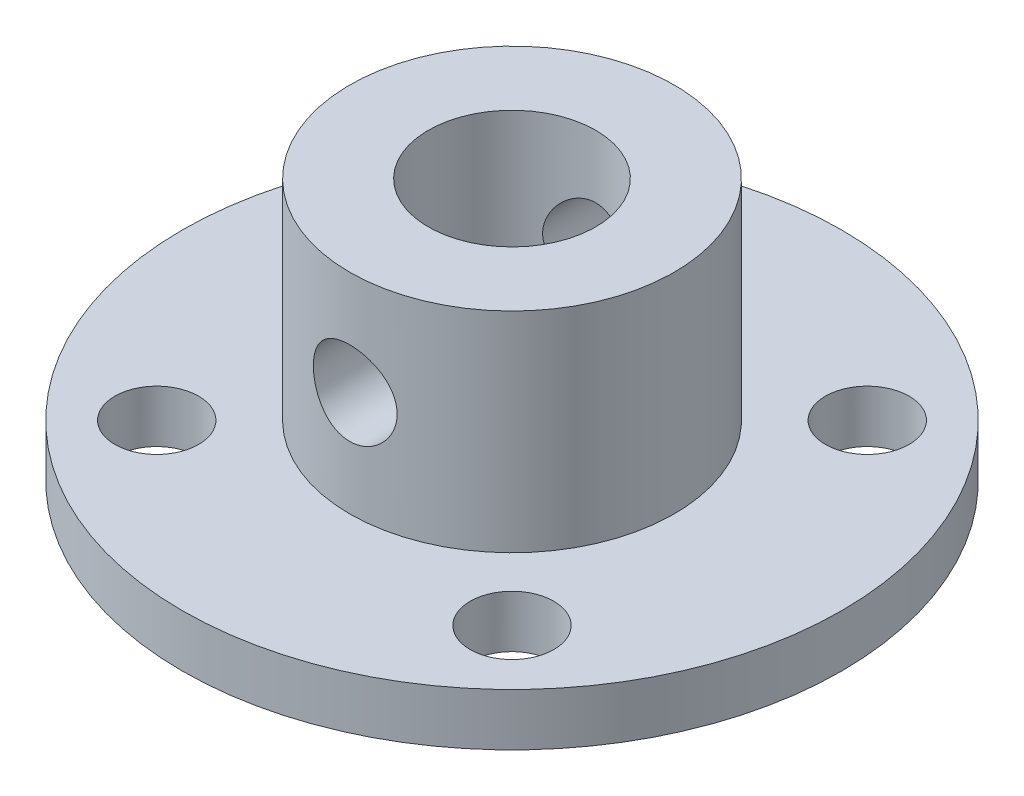
ISO-10303-21;
HEADER;
FILE_DESCRIPTION(('STEP AP214'),'2;1');
FILE_NAME('part.step','',(''),(''),'','','');
FILE_SCHEMA(('AUTOMOTIVE_DESIGN { 1 0 10303 214 1 1 1 1 }'));
ENDSEC;
DATA;
#1=APPLICATION_CONTEXT('core data for automotive mechanical design processes');
#2=APPLICATION_PROTOCOL_DEFINITION('international standard','automotive_design',2000,#1);
#3=PRODUCT_CONTEXT('',#1,'mechanical');
#4=PRODUCT('Part','Part','',(#3));
#5=PRODUCT_RELATED_PRODUCT_CATEGORY('part','',(#4));
#6=PRODUCT_DEFINITION_FORMATION('','',#4);
#7=PRODUCT_DEFINITION_CONTEXT('part definition',#1,'design');
#8=PRODUCT_DEFINITION('design','',#6,#7);
#9=PRODUCT_DEFINITION_SHAPE('','',#8);
#10=(LENGTH_UNIT() NAMED_UNIT(*) SI_UNIT(.MILLI.,.METRE.));
#11=(NAMED_UNIT(*) PLANE_ANGLE_UNIT() SI_UNIT($,.RADIAN.));
#12=(NAMED_UNIT(*) SI_UNIT($,.STERADIAN.) SOLID_ANGLE_UNIT());
#13=UNCERTAINTY_MEASURE_WITH_UNIT(LENGTH_MEASURE(1.E-05),#10,'distance_accuracy_value','');
#14=(GEOMETRIC_REPRESENTATION_CONTEXT(3) GLOBAL_UNCERTAINTY_ASSIGNED_CONTEXT((#13)) GLOBAL_UNIT_ASSIGNED_CONTEXT((#10,
#11,#12)) REPRESENTATION_CONTEXT('',''));
#15=CARTESIAN_POINT('',(0.,0.,0.));
#16=DIRECTION('',(0.,0.,1.));
#17=DIRECTION('',(1.,0.,0.));
#18=AXIS2_PLACEMENT_3D('',#15,#16,#17);
#19=CARTESIAN_POINT('',(0.,2.5,0.));
#20=DIRECTION('',(0.,-1.,0.));
#21=DIRECTION('',(0.,0.,-1.));
#22=AXIS2_PLACEMENT_3D('',#19,#20,#21);
#23=CYLINDRICAL_SURFACE('',#22,15.75);
#24=CARTESIAN_POINT('',(0.,2.5,0.));
#25=DIRECTION('',(0.,1.,0.));
#26=DIRECTION('',(0.,0.,1.));
#27=AXIS2_PLACEMENT_3D('',#24,#25,#26);
#28=CIRCLE('',#27,15.75);
#29=CARTESIAN_POINT('',(0.,2.5,15.75));
#30=VERTEX_POINT('',#29);
#31=EDGE_CURVE('E53',#30,#30,#28,.T.);
#32=ORIENTED_EDGE('',*,*,#31,.F.);
#33=EDGE_LOOP('',(#32));
#34=FACE_BOUND('',#33,.T.);
#35=CARTESIAN_POINT('',(0.,0.,0.));
#36=DIRECTION('',(0.,1.,0.));
#37=DIRECTION('',(0.,0.,1.));
#38=AXIS2_PLACEMENT_3D('',#35,#36,#37);
#39=CIRCLE('',#38,15.75);
#40=CARTESIAN_POINT('',(0.,0.,15.75));
#41=VERTEX_POINT('',#40);
#42=EDGE_CURVE('E58',#41,#41,#39,.T.);
#43=ORIENTED_EDGE('',*,*,#42,.T.);
#44=EDGE_LOOP('',(#43));
#45=FACE_BOUND('',#44,.T.);
#46=ADVANCED_FACE('F41',(#34,#45),#23,.T.);
#47=CARTESIAN_POINT('',(0.,2.5,0.));
#48=DIRECTION('',(0.,1.,0.));
#49=DIRECTION('',(0.,0.,1.));
#50=AXIS2_PLACEMENT_3D('',#47,#48,#49);
#51=PLANE('',#50);
#52=CARTESIAN_POINT('',(-8.48528137423859,2.5,8.48528137423807));
#53=DIRECTION('',(0.,1.,0.));
#54=DIRECTION('',(0.,0.,1.));
#55=AXIS2_PLACEMENT_3D('',#52,#53,#54);
#56=CIRCLE('',#55,2.00000000000052);
#57=CARTESIAN_POINT('',(-8.48528137423859,2.5,10.4852813742386));
#58=VERTEX_POINT('',#57);
#59=EDGE_CURVE('E70',#58,#58,#56,.T.);
#60=ORIENTED_EDGE('',*,*,#59,.F.);
#61=EDGE_LOOP('',(#60));
#62=FACE_BOUND('',#61,.T.);
#63=CARTESIAN_POINT('',(-8.48528137423807,2.5,-8.48528137423907));
#64=DIRECTION('',(0.,1.,0.));
#65=DIRECTION('',(0.,0.,1.));
#66=AXIS2_PLACEMENT_3D('',#63,#64,#65);
#67=CIRCLE('',#66,2.00000000000036);
#68=CARTESIAN_POINT('',(-8.48528137423807,2.5,-6.48528137423871));
#69=VERTEX_POINT('',#68);
#70=EDGE_CURVE('E201',#69,#69,#67,.T.);
#71=ORIENTED_EDGE('',*,*,#70,.F.);
#72=EDGE_LOOP('',(#71));
#73=FACE_BOUND('',#72,.T.);
#74=CARTESIAN_POINT('',(8.48528137423906,2.5,-8.48528137423855));
#75=DIRECTION('',(0.,1.,0.));
#76=DIRECTION('',(0.,0.,1.));
#77=AXIS2_PLACEMENT_3D('',#74,#75,#76);
#78=CIRCLE('',#77,1.99999999999988);
#79=CARTESIAN_POINT('',(8.48528137423906,2.5,-6.48528137423868));
#80=VERTEX_POINT('',#79);
#81=EDGE_CURVE('E199',#80,#80,#78,.T.);
#82=ORIENTED_EDGE('',*,*,#81,.F.);
#83=EDGE_LOOP('',(#82));
#84=FACE_BOUND('',#83,.T.);
#85=CARTESIAN_POINT('',(8.48528137423855,2.5,8.48528137423859));
#86=DIRECTION('',(0.,1.,0.));
#87=DIRECTION('',(0.,0.,1.));
#88=AXIS2_PLACEMENT_3D('',#85,#86,#87);
#89=CIRCLE('',#88,2.);
#90=CARTESIAN_POINT('',(8.48528137423855,2.5,10.4852813742386));
#91=VERTEX_POINT('',#90);
#92=EDGE_CURVE('E196',#91,#91,#89,.T.);
#93=ORIENTED_EDGE('',*,*,#92,.F.);
#94=EDGE_LOOP('',(#93));
#95=FACE_BOUND('',#94,.T.);
#96=CARTESIAN_POINT('',(0.,2.5,0.));
#97=DIRECTION('',(0.,1.,0.));
#98=DIRECTION('',(0.,0.,1.));
#99=AXIS2_PLACEMENT_3D('',#96,#97,#98);
#100=CIRCLE('',#99,7.75);
#101=CARTESIAN_POINT('',(0.,2.5,7.75));
#102=VERTEX_POINT('',#101);
#103=EDGE_CURVE('E10',#102,#102,#100,.T.);
#104=ORIENTED_EDGE('',*,*,#103,.F.);
#105=EDGE_LOOP('',(#104));
#106=FACE_BOUND('',#105,.T.);
#107=ORIENTED_EDGE('',*,*,#31,.T.);
#108=EDGE_LOOP('',(#107));
#109=FACE_BOUND('',#108,.T.);
#110=ADVANCED_FACE('F107',(#62,#73,#84,#95,#106,#109),#51,.T.);
#111=CARTESIAN_POINT('',(0.,0.,0.));
#112=DIRECTION('',(0.,1.,0.));
#113=DIRECTION('',(0.,0.,1.));
#114=AXIS2_PLACEMENT_3D('',#111,#112,#113);
#115=PLANE('',#114);
#116=CARTESIAN_POINT('',(-8.48528137423859,0.,8.48528137423807));
#117=DIRECTION('',(0.,-1.,0.));
#118=DIRECTION('',(0.,0.,-1.));
#119=AXIS2_PLACEMENT_3D('',#116,#117,#118);
#120=CIRCLE('',#119,2.00000000000052);
#121=CARTESIAN_POINT('',(-8.48528137423859,0.,6.48528137423756));
#122=VERTEX_POINT('',#121);
#123=EDGE_CURVE('E185',#122,#122,#120,.T.);
#124=ORIENTED_EDGE('',*,*,#123,.F.);
#125=EDGE_LOOP('',(#124));
#126=FACE_BOUND('',#125,.T.);
#127=CARTESIAN_POINT('',(-8.48528137423807,0.,-8.48528137423907));
#128=DIRECTION('',(0.,-1.,0.));
#129=DIRECTION('',(0.,0.,-1.));
#130=AXIS2_PLACEMENT_3D('',#127,#128,#129);
#131=CIRCLE('',#130,2.00000000000036);
#132=CARTESIAN_POINT('',(-8.48528137423807,0.,-10.4852813742394));
#133=VERTEX_POINT('',#132);
#134=EDGE_CURVE('E186',#133,#133,#131,.T.);
#135=ORIENTED_EDGE('',*,*,#134,.F.);
#136=EDGE_LOOP('',(#135));
#137=FACE_BOUND('',#136,.T.);
#138=CARTESIAN_POINT('',(8.48528137423906,0.,-8.48528137423855));
#139=DIRECTION('',(0.,-1.,0.));
#140=DIRECTION('',(0.,0.,-1.));
#141=AXIS2_PLACEMENT_3D('',#138,#139,#140);
#142=CIRCLE('',#141,1.99999999999988);
#143=CARTESIAN_POINT('',(8.48528137423906,0.,-10.4852813742384));
#144=VERTEX_POINT('',#143);
#145=EDGE_CURVE('E189',#144,#144,#142,.T.);
#146=ORIENTED_EDGE('',*,*,#145,.F.);
#147=EDGE_LOOP('',(#146));
#148=FACE_BOUND('',#147,.T.);
#149=CARTESIAN_POINT('',(8.48528137423855,0.,8.48528137423859));
#150=DIRECTION('',(0.,-1.,0.));
#151=DIRECTION('',(0.,0.,-1.));
#152=AXIS2_PLACEMENT_3D('',#149,#150,#151);
#153=CIRCLE('',#152,2.);
#154=CARTESIAN_POINT('',(8.48528137423855,0.,6.48528137423859));
#155=VERTEX_POINT('',#154);
#156=EDGE_CURVE('E193',#155,#155,#153,.T.);
#157=ORIENTED_EDGE('',*,*,#156,.F.);
#158=EDGE_LOOP('',(#157));
#159=FACE_BOUND('',#158,.T.);
#160=CARTESIAN_POINT('',(0.,0.,0.));
#161=DIRECTION('',(0.,-1.,0.));
#162=DIRECTION('',(0.,0.,-1.));
#163=AXIS2_PLACEMENT_3D('',#160,#161,#162);
#164=CIRCLE('',#163,4.);
#165=CARTESIAN_POINT('',(0.,0.,-4.));
#166=VERTEX_POINT('',#165);
#167=EDGE_CURVE('E217',#166,#166,#164,.T.);
#168=ORIENTED_EDGE('',*,*,#167,.F.);
#169=EDGE_LOOP('',(#168));
#170=FACE_BOUND('',#169,.T.);
#171=ORIENTED_EDGE('',*,*,#42,.F.);
#172=EDGE_LOOP('',(#171));
#173=FACE_BOUND('',#172,.T.);
#174=ADVANCED_FACE('F105',(#126,#137,#148,#159,#170,#173),#115,.F.);
#175=CARTESIAN_POINT('',(0.,12.5,0.));
#176=DIRECTION('',(0.,-1.,0.));
#177=DIRECTION('',(0.,0.,-1.));
#178=AXIS2_PLACEMENT_3D('',#175,#176,#177);
#179=CYLINDRICAL_SURFACE('',#178,7.75);
#180=CARTESIAN_POINT('',(0.,9.5,-7.75));
#181=CARTESIAN_POINT('',(-0.110383787340609,9.49999712165393,-7.74999822046063));
#182=CARTESIAN_POINT('',(-0.220799083360895,9.49083087013231,-7.74761833461278));
#183=CARTESIAN_POINT('',(-0.438457415515612,9.45446770928014,-7.73835534779073));
#184=CARTESIAN_POINT('',(-0.545698752240402,9.42726131698042,-7.73146987843938));
#185=CARTESIAN_POINT('',(-0.753835202841313,9.35575487618119,-7.7139570013691));
#186=CARTESIAN_POINT('',(-0.854738025917002,9.31147607913232,-7.7033342471945));
#187=CARTESIAN_POINT('',(-1.04768442196559,9.20715843304454,-7.67947397600444));
#188=CARTESIAN_POINT('',(-1.13972755530284,9.14711880247176,-7.66623632933212));
#189=CARTESIAN_POINT('',(-1.31435150460384,9.01159937945084,-7.63825645201977));
#190=CARTESIAN_POINT('',(-1.39671131074598,8.93583983534092,-7.62348980265126));
#191=CARTESIAN_POINT('',(-1.54770868730178,8.77162962442938,-7.59427583100733));
#192=CARTESIAN_POINT('',(-1.61634460733163,8.68317743345123,-7.57982854732322));
#193=CARTESIAN_POINT('',(-1.73900346040184,8.49435382987849,-7.55264120329583));
#194=CARTESIAN_POINT('',(-1.79277582110908,8.39381478972686,-7.53993205298238));
#195=CARTESIAN_POINT('',(-1.88256855622015,8.18474268784473,-7.51801746625537));
#196=CARTESIAN_POINT('',(-1.91859197446948,8.07621100048127,-7.50881142913896));
#197=CARTESIAN_POINT('',(-1.97110380346532,7.85667305314799,-7.49519692802346));
#198=CARTESIAN_POINT('',(-1.98799119259462,7.74576843640866,-7.49069064178648));
#199=CARTESIAN_POINT('',(-2.00299489039154,7.52261577878462,-7.48669331148346));
#200=CARTESIAN_POINT('',(-2.00111446722953,7.4103679751986,-7.48720139423013));
#201=CARTESIAN_POINT('',(-1.97895349243664,7.19079970771578,-7.49308764136353));
#202=CARTESIAN_POINT('',(-1.95915184286214,7.08342697471634,-7.49833904463553));
#203=CARTESIAN_POINT('',(-1.90247592665814,6.87358166861578,-7.51291776462266));
#204=CARTESIAN_POINT('',(-1.86560037297918,6.77110946556452,-7.52224538860476));
#205=CARTESIAN_POINT('',(-1.77542385229002,6.57270697850989,-7.54403957444235));
#206=CARTESIAN_POINT('',(-1.72195190635953,6.47685811736588,-7.55653855141017));
#207=CARTESIAN_POINT('',(-1.60021990551907,6.29532356551893,-7.58324924275072));
#208=CARTESIAN_POINT('',(-1.53195710784467,6.20963976435615,-7.59746127456924));
#209=CARTESIAN_POINT('',(-1.38011570794182,6.04812705306299,-7.62652757501988));
#210=CARTESIAN_POINT('',(-1.29613390290681,5.97267784621993,-7.64138821972832));
#211=CARTESIAN_POINT('',(-1.11652972744989,5.83685914556915,-7.66968797392626));
#212=CARTESIAN_POINT('',(-1.02090695421456,5.7764901738048,-7.68312703419448));
#213=CARTESIAN_POINT('',(-0.820171458279471,5.67239303832443,-7.70714360432393));
#214=CARTESIAN_POINT('',(-0.715023585284149,5.62872989782012,-7.71770988739326));
#215=CARTESIAN_POINT('',(-0.498545902427573,5.55980724639365,-7.73470898823158));
#216=CARTESIAN_POINT('',(-0.387217360026605,5.53454397713152,-7.74114265009408));
#217=CARTESIAN_POINT('',(-0.164782105504617,5.50372583792837,-7.74902538970942));
#218=CARTESIAN_POINT('',(-0.0537515006363341,5.49765429560891,-7.7506051099783));
#219=CARTESIAN_POINT('',(0.167740304524593,5.50397021514081,-7.74897574090846));
#220=CARTESIAN_POINT('',(0.278201558642833,5.51635589871887,-7.74576711290619));
#221=CARTESIAN_POINT('',(0.493600474920873,5.55880976074264,-7.73500561517564));
#222=CARTESIAN_POINT('',(0.598598102511294,5.58859306167523,-7.72752277632402));
#223=CARTESIAN_POINT('',(0.802099196004325,5.66466874642068,-7.70905868077741));
#224=CARTESIAN_POINT('',(0.900601980913076,5.71096285816524,-7.69807705793154));
#225=CARTESIAN_POINT('',(1.09035006941602,5.81972682954553,-7.673523815087));
#226=CARTESIAN_POINT('',(1.18142586964661,5.88248211913906,-7.65990773326972));
#227=CARTESIAN_POINT('',(1.35193641760714,6.02202510537294,-7.6316610393624));
#228=CARTESIAN_POINT('',(1.43136901288928,6.09881539074418,-7.61703024041897));
#229=CARTESIAN_POINT('',(1.57849057989131,6.26665363412232,-7.58792781929462));
#230=CARTESIAN_POINT('',(1.64581606892716,6.35802325012453,-7.57347048493218));
#231=CARTESIAN_POINT('',(1.76418229182998,6.55106518315414,-7.54677789877813));
#232=CARTESIAN_POINT('',(1.81522373314523,6.65273705235492,-7.53454255046394));
#233=CARTESIAN_POINT('',(1.8991895282315,6.86296694586621,-7.51381729507513));
#234=CARTESIAN_POINT('',(1.93222056300907,6.9714800782661,-7.5053053936583));
#235=CARTESIAN_POINT('',(1.97949650095441,7.19277497579931,-7.49297683012217));
#236=CARTESIAN_POINT('',(1.99374583789703,7.30555572701115,-7.48915905987878));
#237=CARTESIAN_POINT('',(2.00281094210074,7.52847508948493,-7.48673938132773));
#238=CARTESIAN_POINT('',(1.99820917477,7.63858868460881,-7.48798113627354));
#239=CARTESIAN_POINT('',(1.97104436516981,7.85641266459903,-7.49517695476263));
#240=CARTESIAN_POINT('',(1.94848173080093,7.96412310398516,-7.50113091128936));
#241=CARTESIAN_POINT('',(1.88636325940165,8.17340245535815,-7.51699027957696));
#242=CARTESIAN_POINT('',(1.84692342920418,8.27500798951014,-7.52686868370844));
#243=CARTESIAN_POINT('',(1.75226094061102,8.47023465074284,-7.54946614542286));
#244=CARTESIAN_POINT('',(1.69703595372531,8.56385459721122,-7.56218562203573));
#245=CARTESIAN_POINT('',(1.57057374827481,8.74325090480199,-7.58947202041989));
#246=CARTESIAN_POINT('',(1.49893553788343,8.82873833938132,-7.60408034159393));
#247=CARTESIAN_POINT('',(1.3424529125549,8.98666779026213,-7.63325904781831));
#248=CARTESIAN_POINT('',(1.25760533256207,9.0591066710442,-7.6478294229236));
#249=CARTESIAN_POINT('',(1.07510048325458,9.19027608891172,-7.67563253510795));
#250=CARTESIAN_POINT('',(0.977224281319255,9.2487093150919,-7.68883336491904));
#251=CARTESIAN_POINT('',(0.772703241296744,9.34819959212105,-7.71206770351318));
#252=CARTESIAN_POINT('',(0.66606443578981,9.38926847964389,-7.72210336869097));
#253=CARTESIAN_POINT('',(0.466426088178445,9.44711843605536,-7.73648102286807));
#254=CARTESIAN_POINT('',(0.37433572609507,9.46690465721294,-7.74151481567714));
#255=CARTESIAN_POINT('',(0.188171094164359,9.49334610220253,-7.74827492071573));
#256=CARTESIAN_POINT('',(0.0940969953858301,9.50000245365487,-7.75000151697375));
#257=CARTESIAN_POINT('',(0.,9.5,-7.75));
#258=B_SPLINE_CURVE_WITH_KNOTS('',3,(#180,#181,#182,#183,#184,#185,#186,#187,#188,#189,#190,
#191,#192,#193,#194,#195,#196,#197,#198,#199,#200,#201,#202,#203,#204,#205,#206,#207,#208,#209,
#210,#211,#212,#213,#214,#215,#216,#217,#218,#219,#220,#221,#222,#223,#224,#225,#226,#227,#228,
#229,#230,#231,#232,#233,#234,#235,#236,#237,#238,#239,#240,#241,#242,#243,#244,#245,#246,#247,
#248,#249,#250,#251,#252,#253,#254,#255,#256,#257),.UNSPECIFIED.,.T.,.F.,(4,2,2,2,2,2,2,2,2,2,2,
2,2,2,2,2,2,2,2,2,2,2,2,2,2,2,2,2,2,2,2,2,2,2,2,2,2,2,4),(0.,0.330806414283058,0.66178685805823,
0.992356626014535,1.32294278906136,1.66001322354748,1.99712416853142,2.33961271605262,
2.68204250821996,3.01719326512499,3.35228566090385,3.67867964749599,4.00509824202833,
4.33499801144464,4.66495900876937,5.00497116268885,5.3449950854237,5.68632931839426,
6.0275938111951,6.35958903742948,6.69155227943838,7.01822638624752,7.34493469102974,
7.67773281346472,8.01059238200392,8.35219952209188,8.69379181929156,9.03333815377905,
9.37280431757045,9.70186195410185,10.0309121177772,10.3577359673368,10.6846080520306,
11.0205301175794,11.3565327965933,11.69913735326,12.0415079901552,12.3235291461771,
12.6055260805851),.UNSPECIFIED.);
#259=CARTESIAN_POINT('',(0.,9.5,-7.75));
#260=VERTEX_POINT('',#259);
#261=EDGE_CURVE('E94',#260,#260,#258,.T.);
#262=ORIENTED_EDGE('',*,*,#261,.T.);
#263=EDGE_LOOP('',(#262));
#264=FACE_BOUND('',#263,.T.);
#265=CARTESIAN_POINT('',(2.,7.5,7.48748956593597));
#266=CARTESIAN_POINT('',(1.99999708339678,7.38968523771593,7.48749159115617));
#267=CARTESIAN_POINT('',(1.99084189736926,7.27933888923081,7.48995413854906));
#268=CARTESIAN_POINT('',(1.95452666582508,7.06182356369867,7.49951105829792));
#269=CARTESIAN_POINT('',(1.92735683423062,6.95465634672405,7.50660794813137));
#270=CARTESIAN_POINT('',(1.85595722620788,6.74667712926736,7.52457745921449));
#271=CARTESIAN_POINT('',(1.81175040547528,6.64585678872678,7.53544499792305));
#272=CARTESIAN_POINT('',(1.70760258133058,6.45305022174242,7.55972491018804));
#273=CARTESIAN_POINT('',(1.6476606434167,6.36106452042736,7.57313743487696));
#274=CARTESIAN_POINT('',(1.51224278816648,6.18638260297186,7.60134812070625));
#275=CARTESIAN_POINT('',(1.43646511752854,6.10392403005387,7.61616958978227));
#276=CARTESIAN_POINT('',(1.27217633534031,5.95273408017098,7.6453264535293));
#277=CARTESIAN_POINT('',(1.18366397419268,5.88400405190836,7.65966180032856));
#278=CARTESIAN_POINT('',(0.994780869325527,5.76124100343208,7.68649014825801));
#279=CARTESIAN_POINT('',(0.894252785243237,5.70744277443067,7.69895244169968));
#280=CARTESIAN_POINT('',(0.68520409550866,5.61759927158333,7.7203638845869));
#281=CARTESIAN_POINT('',(0.576684752124886,5.58155120087587,7.72931358746011));
#282=CARTESIAN_POINT('',(0.357212942059581,5.52899625048946,7.74252667099711));
#283=CARTESIAN_POINT('',(0.246363115508431,5.51208548067661,7.74688677046703));
#284=CARTESIAN_POINT('',(0.0233198429028584,5.49701598600579,7.7507669585505));
#285=CARTESIAN_POINT('',(-0.088873389239389,5.49885431434419,7.75028780775116));
#286=CARTESIAN_POINT('',(-0.308612739330148,5.52094323405682,7.74461494102066));
#287=CARTESIAN_POINT('',(-0.416206020910783,5.54075767294301,7.73953290913722));
#288=CARTESIAN_POINT('',(-0.626485542917924,5.59753359865844,7.72535617242004));
#289=CARTESIAN_POINT('',(-0.729171512554399,5.63449603052758,7.71626124643377));
#290=CARTESIAN_POINT('',(-0.927853594022897,5.7248626945504,7.69491226087938));
#291=CARTESIAN_POINT('',(-1.02377710797567,5.77841938127451,7.68262908752058));
#292=CARTESIAN_POINT('',(-1.2054262045259,5.90033799084136,7.65623177625059));
#293=CARTESIAN_POINT('',(-1.29114990556521,5.9687026387668,7.64211730152025));
#294=CARTESIAN_POINT('',(-1.45256830517694,6.1206238708358,7.61311184673548));
#295=CARTESIAN_POINT('',(-1.52790308877493,6.20456126110147,7.59821021038169));
#296=CARTESIAN_POINT('',(-1.66351110247039,6.38403345153078,7.56967940764225));
#297=CARTESIAN_POINT('',(-1.72378353040901,6.47956886895505,7.55605030905092));
#298=CARTESIAN_POINT('',(-1.82780690814597,6.68026654737413,7.53156731567602));
#299=CARTESIAN_POINT('',(-1.87146591174214,6.78547849394777,7.52072896995814));
#300=CARTESIAN_POINT('',(-1.94036141780756,7.00209731755711,7.50325094358268));
#301=CARTESIAN_POINT('',(-1.96560215810012,7.11350276318968,7.49661029713148));
#302=CARTESIAN_POINT('',(-1.996336425365,7.33599492137381,7.488483721494));
#303=CARTESIAN_POINT('',(-2.00236436283218,7.44700280357322,7.4868583332836));
#304=CARTESIAN_POINT('',(-1.9959694288894,7.6684393483886,7.48856576593597));
#305=CARTESIAN_POINT('',(-1.98354838090377,7.77886806716429,7.49189809679757));
#306=CARTESIAN_POINT('',(-1.94107787769654,7.99399181870416,7.50301134830841));
#307=CARTESIAN_POINT('',(-1.91134435996749,8.09875374384951,7.51071247904503));
#308=CARTESIAN_POINT('',(-1.83544558161457,8.30180512125044,7.52961880541102));
#309=CARTESIAN_POINT('',(-1.78927827790233,8.40009376693086,7.54082443670742));
#310=CARTESIAN_POINT('',(-1.68071995770853,8.58965930968849,7.56576727266374));
#311=CARTESIAN_POINT('',(-1.61801214059362,8.68074836528079,7.57955218801861));
#312=CARTESIAN_POINT('',(-1.47854964086054,8.8513071505076,7.60798563521993));
#313=CARTESIAN_POINT('',(-1.40179249171774,8.93077483546051,7.62263431840436));
#314=CARTESIAN_POINT('',(-1.23394835760472,9.07802538212025,7.65162096658878));
#315=CARTESIAN_POINT('',(-1.14253189292356,9.14543712317506,7.66594002183517));
#316=CARTESIAN_POINT('',(-0.949368049794681,9.26395499712507,7.69224849874796));
#317=CARTESIAN_POINT('',(-0.847621217933787,9.3150619921235,7.70423804357265));
#318=CARTESIAN_POINT('',(-0.637396714748702,9.39906273698925,7.72445997444537));
#319=CARTESIAN_POINT('',(-0.528975253867057,9.43209022386593,7.73271986732293));
#320=CARTESIAN_POINT('',(-0.307877952417657,9.47938989414569,7.7446725719236));
#321=CARTESIAN_POINT('',(-0.195202995522921,9.49366595137867,7.74836632694903));
#322=CARTESIAN_POINT('',(0.0277257217511358,9.50282773553264,7.75072918210563));
#323=CARTESIAN_POINT('',(0.137955868476205,9.49825954674783,7.74953979480622));
#324=CARTESIAN_POINT('',(0.356022138291029,9.4711214791658,7.74258677739726));
#325=CARTESIAN_POINT('',(0.463858341163788,9.44855220121968,7.73682329996447));
#326=CARTESIAN_POINT('',(0.673463299017029,9.38635325900367,7.72139457149616));
#327=CARTESIAN_POINT('',(0.775264945256995,9.34682811060428,7.71175324585485));
#328=CARTESIAN_POINT('',(0.970849569395365,9.25193335729456,7.68958059596954));
#329=CARTESIAN_POINT('',(1.0646314781186,9.19656164401621,7.67704888720633));
#330=CARTESIAN_POINT('',(1.24408167813122,9.06991215339629,7.65004637377751));
#331=CARTESIAN_POINT('',(1.32948511581462,8.99826785405477,7.63553457707957));
#332=CARTESIAN_POINT('',(1.48724241741582,8.84181066686136,7.6063828223503));
#333=CARTESIAN_POINT('',(1.55959291002842,8.75699438745559,7.59174283223008));
#334=CARTESIAN_POINT('',(1.69063301600981,8.5745365388047,7.56365335826931));
#335=CARTESIAN_POINT('',(1.74901677022888,8.47667028760013,7.5502339379978));
#336=CARTESIAN_POINT('',(1.84841707266387,8.27217783837293,7.52651868712052));
#337=CARTESIAN_POINT('',(1.88944565577381,8.16555777212445,7.51622069337954));
#338=CARTESIAN_POINT('',(1.94721184237719,7.96601699726258,7.50143877093394));
#339=CARTESIAN_POINT('',(1.9669626907454,7.87400965235245,7.49624857263925));
#340=CARTESIAN_POINT('',(1.9933573686596,7.68800905501106,7.48927327437875));
#341=CARTESIAN_POINT('',(2.00000248568151,7.59401599856838,7.4874878399376));
#342=CARTESIAN_POINT('',(2.,7.5,7.48748956593597));
#343=B_SPLINE_CURVE_WITH_KNOTS('',3,(#265,#266,#267,#268,#269,#270,#271,#272,#273,#274,#275,
#276,#277,#278,#279,#280,#281,#282,#283,#284,#285,#286,#287,#288,#289,#290,#291,#292,#293,#294,
#295,#296,#297,#298,#299,#300,#301,#302,#303,#304,#305,#306,#307,#308,#309,#310,#311,#312,#313,
#314,#315,#316,#317,#318,#319,#320,#321,#322,#323,#324,#325,#326,#327,#328,#329,#330,#331,#332,
#333,#334,#335,#336,#337,#338,#339,#340,#341,#342),.UNSPECIFIED.,.T.,.F.,(4,2,2,2,2,2,2,2,2,2,2,
2,2,2,2,2,2,2,2,2,2,2,2,2,2,2,2,2,2,2,2,2,2,2,2,2,2,2,4),(0.,0.330598817328823,
0.661377372821718,0.991711785677321,1.3220658213906,1.65940742987136,1.99678216275712,
2.33919479919956,2.68155346500017,3.01654346966997,3.3514808246314,3.67850280904225,
4.00554281804283,4.33568125768041,4.66588050380281,5.00558898158817,5.34531554699018,
5.68689587473417,6.02839758410463,6.36031345181578,6.69219651646611,7.01820482299175,
7.34425367382939,7.67706887016989,8.0099425522541,8.35175583547379,8.6935510425338,
9.03278254184269,9.37194394879364,9.70134693378592,10.030738924229,10.3581290775358,
10.6855628100093,11.0212691601264,11.3570620924939,11.6996458873521,12.0419917274483,
12.3237729788928,12.6055265474374),.UNSPECIFIED.);
#344=CARTESIAN_POINT('',(2.,7.5,7.48748956593597));
#345=VERTEX_POINT('',#344);
#346=EDGE_CURVE('E87',#345,#345,#343,.T.);
#347=ORIENTED_EDGE('',*,*,#346,.T.);
#348=EDGE_LOOP('',(#347));
#349=FACE_BOUND('',#348,.T.);
#350=CARTESIAN_POINT('',(0.,12.5,0.));
#351=DIRECTION('',(0.,1.,0.));
#352=DIRECTION('',(0.,0.,1.));
#353=AXIS2_PLACEMENT_3D('',#350,#351,#352);
#354=CIRCLE('',#353,7.75);
#355=CARTESIAN_POINT('',(0.,12.5,7.75));
#356=VERTEX_POINT('',#355);
#357=EDGE_CURVE('E61',#356,#356,#354,.T.);
#358=ORIENTED_EDGE('',*,*,#357,.F.);
#359=EDGE_LOOP('',(#358));
#360=FACE_BOUND('',#359,.T.);
#361=ORIENTED_EDGE('',*,*,#103,.T.);
#362=EDGE_LOOP('',(#361));
#363=FACE_BOUND('',#362,.T.);
#364=ADVANCED_FACE('F100',(#264,#349,#360,#363),#179,.T.);
#365=CARTESIAN_POINT('',(0.,12.5,0.));
#366=DIRECTION('',(0.,1.,0.));
#367=DIRECTION('',(0.,0.,1.));
#368=AXIS2_PLACEMENT_3D('',#365,#366,#367);
#369=PLANE('',#368);
#370=CARTESIAN_POINT('',(0.,12.5,0.));
#371=DIRECTION('',(0.,-1.,0.));
#372=DIRECTION('',(0.,0.,-1.));
#373=AXIS2_PLACEMENT_3D('',#370,#371,#372);
#374=CIRCLE('',#373,4.);
#375=CARTESIAN_POINT('',(0.,12.5,-4.));
#376=VERTEX_POINT('',#375);
#377=EDGE_CURVE('E219',#376,#376,#374,.T.);
#378=ORIENTED_EDGE('',*,*,#377,.T.);
#379=EDGE_LOOP('',(#378));
#380=FACE_BOUND('',#379,.T.);
#381=ORIENTED_EDGE('',*,*,#357,.T.);
#382=EDGE_LOOP('',(#381));
#383=FACE_BOUND('',#382,.T.);
#384=ADVANCED_FACE('F104',(#380,#383),#369,.T.);
#385=CARTESIAN_POINT('',(0.,12.5,0.));
#386=DIRECTION('',(0.,-1.,0.));
#387=DIRECTION('',(0.,0.,-1.));
#388=AXIS2_PLACEMENT_3D('',#385,#386,#387);
#389=CYLINDRICAL_SURFACE('',#388,4.);
#390=CARTESIAN_POINT('',(0.,9.5,-4.));
#391=CARTESIAN_POINT('',(0.105143925902467,9.49999339536562,-3.99999426810082));
#392=CARTESIAN_POINT('',(0.210413199395125,9.49165985375789,-3.99580982039513));
#393=CARTESIAN_POINT('',(0.417840470537792,9.45869423931692,-3.97948312074314));
#394=CARTESIAN_POINT('',(0.519992173427259,9.43403121400437,-3.96732575657839));
#395=CARTESIAN_POINT('',(0.717867089760898,9.36961238276674,-3.93632558806751));
#396=CARTESIAN_POINT('',(0.813613605878293,9.32991523150407,-3.91750878355075));
#397=CARTESIAN_POINT('',(0.996945233613198,9.23685875727003,-3.87491553031523));
#398=CARTESIAN_POINT('',(1.08453098798012,9.18350051150227,-3.85113947267051));
#399=CARTESIAN_POINT('',(1.25501563552382,9.06096550102943,-3.79912516516124));
#400=CARTESIAN_POINT('',(1.33731042224422,8.99102704152073,-3.77070398255074));
#401=CARTESIAN_POINT('',(1.48955888973396,8.83895704150593,-3.71319940493486));
#402=CARTESIAN_POINT('',(1.55950316621354,8.75681629645512,-3.68411552418069));
#403=CARTESIAN_POINT('',(1.69050400090056,8.57503330095324,-3.62597902394695));
#404=CARTESIAN_POINT('',(1.75045067110327,8.47452780330818,-3.59710373940264));
#405=CARTESIAN_POINT('',(1.85233645378139,8.26326532802757,-3.54571957544641));
#406=CARTESIAN_POINT('',(1.89428842993267,8.1525157425545,-3.52320615213979));
#407=CARTESIAN_POINT('',(1.95626488437718,7.93066978915616,-3.48915734075617));
#408=CARTESIAN_POINT('',(1.97745171416088,7.81999109586521,-3.47704543167427));
#409=CARTESIAN_POINT('',(2.00085398661769,7.59604232444105,-3.46363779897055));
#410=CARTESIAN_POINT('',(2.00308817674615,7.48277491825769,-3.46233138686576));
#411=CARTESIAN_POINT('',(1.98937457434459,7.27142795136926,-3.47021860514497));
#412=CARTESIAN_POINT('',(1.97556911907364,7.1731519375539,-3.47817527324027));
#413=CARTESIAN_POINT('',(1.93387969811387,6.98055618125392,-3.50152457467701));
#414=CARTESIAN_POINT('',(1.9059912477953,6.88623770938937,-3.51691957663553));
#415=CARTESIAN_POINT('',(1.83641956077201,6.70154173486868,-3.55374952825482));
#416=CARTESIAN_POINT('',(1.79443013423199,6.61130720242842,-3.57531681327997));
#417=CARTESIAN_POINT('',(1.69808337533601,6.43873141481998,-3.62206808562807));
#418=CARTESIAN_POINT('',(1.64372048762494,6.35639372879982,-3.64725369560381));
#419=CARTESIAN_POINT('',(1.51613210982558,6.19095749451355,-3.70226315806571));
#420=CARTESIAN_POINT('',(1.44138891673856,6.10908625284769,-3.73227020473492));
#421=CARTESIAN_POINT('',(1.27911115748275,5.9585291628182,-3.79095246600814));
#422=CARTESIAN_POINT('',(1.19157051314857,5.88984961593224,-3.81962703917602));
#423=CARTESIAN_POINT('',(1.0010330116637,5.76462867794055,-3.87403974565928));
#424=CARTESIAN_POINT('',(0.897507183198819,5.70879905510852,-3.89957968324014));
#425=CARTESIAN_POINT('',(0.680932430977594,5.61580594191398,-3.94315762242484));
#426=CARTESIAN_POINT('',(0.567891152530552,5.57862762996967,-3.96120157887106));
#427=CARTESIAN_POINT('',(0.345532983321405,5.52704919256665,-3.98648667482871));
#428=CARTESIAN_POINT('',(0.236683061096653,5.51101752850644,-3.9944987660262));
#429=CARTESIAN_POINT('',(0.0175591998987042,5.49707053773102,-4.00146026918207));
#430=CARTESIAN_POINT('',(-0.0927140397398164,5.49914662872106,-4.00041397442637));
#431=CARTESIAN_POINT('',(-0.302465943971973,5.52041337683749,-3.9898238450687));
#432=CARTESIAN_POINT('',(-0.402118816099859,5.53826506545999,-3.98094491376337));
#433=CARTESIAN_POINT('',(-0.596813784603881,5.58847614379024,-3.95644342629681));
#434=CARTESIAN_POINT('',(-0.691855371382173,5.62083713290699,-3.94082012668824));
#435=CARTESIAN_POINT('',(-0.877777216899144,5.69999693286607,-3.90368502827176));
#436=CARTESIAN_POINT('',(-0.968460794011606,5.74718210023257,-3.88201763539262));
#437=CARTESIAN_POINT('',(-1.14092272339854,5.85421507129314,-3.83487948634835));
#438=CARTESIAN_POINT('',(-1.22269725955318,5.91406826919079,-3.80940711133877));
#439=CARTESIAN_POINT('',(-1.38353537857843,6.05152085066143,-3.75416442672396));
#440=CARTESIAN_POINT('',(-1.46154415563805,6.13028573689029,-3.72421769686998));
#441=CARTESIAN_POINT('',(-1.60371264223771,6.29985030255546,-3.6652478321764));
#442=CARTESIAN_POINT('',(-1.66786277142375,6.39065823769584,-3.63622534800094));
#443=CARTESIAN_POINT('',(-1.78341582895803,6.58728730834595,-3.58102384412979));
#444=CARTESIAN_POINT('',(-1.8340509916005,6.69362253218896,-3.55505059178121));
#445=CARTESIAN_POINT('',(-1.91616565186941,6.91502013514993,-3.51148144588269));
#446=CARTESIAN_POINT('',(-1.94766983173403,7.03007105293378,-3.493874764435));
#447=CARTESIAN_POINT('',(-1.98772337493374,7.25382044576941,-3.47123002051604));
#448=CARTESIAN_POINT('',(-1.9981859928109,7.36206850687048,-3.4651476693013));
#449=CARTESIAN_POINT('',(-2.0013783087524,7.57889413432905,-3.46330709283207));
#450=CARTESIAN_POINT('',(-1.99411569324648,7.68747153747572,-3.4675443925278));
#451=CARTESIAN_POINT('',(-1.96385225118662,7.89096700306688,-3.48475724102153));
#452=CARTESIAN_POINT('',(-1.94241662868607,7.98620094028948,-3.49686188965317));
#453=CARTESIAN_POINT('',(-1.88635071644882,8.17161623884873,-3.52742032375305));
#454=CARTESIAN_POINT('',(-1.85171618231984,8.26179596418407,-3.54587615139337));
#455=CARTESIAN_POINT('',(-1.76763149060113,8.44124970197307,-3.58857060729071));
#456=CARTESIAN_POINT('',(-1.7173422756314,8.53005580365806,-3.61311444791841));
#457=CARTESIAN_POINT('',(-1.60430194327478,8.69854907236252,-3.66470663269721));
#458=CARTESIAN_POINT('',(-1.54154434248312,8.77823146104222,-3.69175627591221));
#459=CARTESIAN_POINT('',(-1.39640665332275,8.93628396470935,-3.74924646316184));
#460=CARTESIAN_POINT('',(-1.31256884599452,9.01331820470058,-3.77969966613256));
#461=CARTESIAN_POINT('',(-1.13230961246639,9.15252596687054,-3.83755504519861));
#462=CARTESIAN_POINT('',(-1.03588144661039,9.21469147893981,-3.8649555725239));
#463=CARTESIAN_POINT('',(-0.831863193565892,9.32247272542414,-3.91396019133075));
#464=CARTESIAN_POINT('',(-0.724199007553462,9.36796833847294,-3.93552192987866));
#465=CARTESIAN_POINT('',(-0.501484202276174,9.43961633551482,-3.97002682597974));
#466=CARTESIAN_POINT('',(-0.3864555991782,9.46582369361143,-3.98299446726136));
#467=CARTESIAN_POINT('',(-0.22520389298179,9.48779482217148,-3.99390923826956));
#468=CARTESIAN_POINT('',(-0.180323758883129,9.49236528173268,-3.99618730680502));
#469=CARTESIAN_POINT('',(-0.0903034636101829,9.49846933102817,-3.99923393953631));
#470=CARTESIAN_POINT('',(-0.0451632952932567,9.50000283694042,-4.00000246206762));
#471=CARTESIAN_POINT('',(0.,9.5,-4.));
#472=B_SPLINE_CURVE_WITH_KNOTS('',3,(#390,#391,#392,#393,#394,#395,#396,#397,#398,#399,#400,
#401,#402,#403,#404,#405,#406,#407,#408,#409,#410,#411,#412,#413,#414,#415,#416,#417,#418,#419,
#420,#421,#422,#423,#424,#425,#426,#427,#428,#429,#430,#431,#432,#433,#434,#435,#436,#437,#438,
#439,#440,#441,#442,#443,#444,#445,#446,#447,#448,#449,#450,#451,#452,#453,#454,#455,#456,#457,
#458,#459,#460,#461,#462,#463,#464,#465,#466,#467,#468,#469,#470,#471),.UNSPECIFIED.,.T.,.F.,(4,
2,2,2,2,2,2,2,2,2,2,2,2,2,2,2,2,2,2,2,2,2,2,2,2,2,2,2,2,2,2,2,2,2,2,2,2,2,2,2,4),(0.,
0.315248514840585,0.631096299418396,0.945724310984597,1.26032752116314,1.59396351743618,
1.92785247530807,2.28763452861505,2.64715895796562,2.98516024280459,3.32282714658041,
3.62011424818641,3.91749607851357,4.22180480336975,4.52625042520444,4.86929882667757,
5.21251069197373,5.57166044428881,5.93052433824559,6.25966580942691,6.58865129022952,
6.89213813012244,7.19565843261863,7.50785712055797,7.82018901496679,8.16319221288838,
8.50643177230864,8.86629364323452,9.22569023890902,9.55058615006093,9.87534119729357,
10.1691586049771,10.463070575767,10.7767291356057,11.0905512228726,11.4425048551434,
11.7946476676249,12.1492802732705,12.502898172423,12.6383056026783,12.7737167702213),.UNSPECIFIED.);
#473=CARTESIAN_POINT('',(0.,9.5,-4.));
#474=VERTEX_POINT('',#473);
#475=EDGE_CURVE('E44',#474,#474,#472,.T.);
#476=ORIENTED_EDGE('',*,*,#475,.T.);
#477=EDGE_LOOP('',(#476));
#478=FACE_BOUND('',#477,.T.);
#479=CARTESIAN_POINT('',(2.,7.5,3.46410161513775));
#480=CARTESIAN_POINT('',(1.99999158748781,7.60421320547434,3.46411185715888));
#481=CARTESIAN_POINT('',(1.99179963610437,7.7085621765338,3.46887633544978));
#482=CARTESIAN_POINT('',(1.95944672580053,7.9140551772306,3.48724701669072));
#483=CARTESIAN_POINT('',(1.93525221095662,8.01519200324776,3.50087179788183));
#484=CARTESIAN_POINT('',(1.8721998159803,8.21090315644694,3.53498701490001));
#485=CARTESIAN_POINT('',(1.83341988295963,8.30550925884925,3.55544089069169));
#486=CARTESIAN_POINT('',(1.74253507245138,8.48684845047615,3.60085327291133));
#487=CARTESIAN_POINT('',(1.69042947410139,8.57358111343678,3.62581202301253));
#488=CARTESIAN_POINT('',(1.569333074538,8.74461144313339,3.67993738819289));
#489=CARTESIAN_POINT('',(1.49930407053533,8.82811826759177,3.70928127465103));
#490=CARTESIAN_POINT('',(1.34650761698202,8.9828167805706,3.76743965382121));
#491=CARTESIAN_POINT('',(1.26373385204841,9.05400232620397,3.79625387610258));
#492=CARTESIAN_POINT('',(1.08097912631265,9.1867343011885,3.85242953961661));
#493=CARTESIAN_POINT('',(0.980214377887152,9.24730753542331,3.87956212851245));
#494=CARTESIAN_POINT('',(0.768314053336916,9.35028170678709,3.92701512184167));
#495=CARTESIAN_POINT('',(0.657185076311985,9.3926941123508,3.94733982363631));
#496=CARTESIAN_POINT('',(0.436089887818817,9.45500932253118,3.97760922492053));
#497=CARTESIAN_POINT('',(0.326603580968785,9.4762990526921,3.9881896044274));
#498=CARTESIAN_POINT('',(0.10514125740454,9.50033223736903,4.00015167691179));
#499=CARTESIAN_POINT('',(-0.00683321168520792,9.50308691359629,4.00153893568935));
#500=CARTESIAN_POINT('',(-0.219665048849572,9.49050665205486,3.99525963833124));
#501=CARTESIAN_POINT('',(-0.320642398354139,9.47672396895637,3.98836991784381));
#502=CARTESIAN_POINT('',(-0.518627543836089,9.43423831219188,3.96748490519435));
#503=CARTESIAN_POINT('',(-0.615635042187701,9.40553422204787,3.95348908132771));
#504=CARTESIAN_POINT('',(-0.804618783139259,9.33383486782005,3.91943166575325));
#505=CARTESIAN_POINT('',(-0.896506847030398,9.29064737365578,3.89928883058403));
#506=CARTESIAN_POINT('',(-1.07195360302662,9.1914731675971,3.8547529197337));
#507=CARTESIAN_POINT('',(-1.15550929767728,9.13548187339533,3.83035832314967));
#508=CARTESIAN_POINT('',(-1.3203473217964,9.00620929693394,3.7768878879846));
#509=CARTESIAN_POINT('',(-1.40066815005872,8.93179394334797,3.7475875199635));
#510=CARTESIAN_POINT('',(-1.54820874059556,8.77082055013966,3.68908681173623));
#511=CARTESIAN_POINT('',(-1.61541842314846,8.68425325545188,3.65988656531257));
#512=CARTESIAN_POINT('',(-1.73901066928442,8.49470361515182,3.60288312184969));
#513=CARTESIAN_POINT('',(-1.7944346299561,8.39102795389158,3.57528639981415));
#514=CARTESIAN_POINT('',(-1.88663822600246,8.174124657282,3.52750900557152));
#515=CARTESIAN_POINT('',(-1.92343731642178,8.06090713396487,3.50732060092135));
#516=CARTESIAN_POINT('',(-1.97436042205008,7.83757097743442,3.47889271634069));
#517=CARTESIAN_POINT('',(-1.99005024423995,7.7279177619129,3.46983311696993));
#518=CARTESIAN_POINT('',(-2.00303389322285,7.50719731696691,3.46235838723219));
#519=CARTESIAN_POINT('',(-2.00034071463005,7.3961311417604,3.46393573778623));
#520=CARTESIAN_POINT('',(-1.97807208668793,7.18869216284256,3.4766867308117));
#521=CARTESIAN_POINT('',(-1.96037563342492,7.09204109778422,3.48679175013308));
#522=CARTESIAN_POINT('',(-1.91139256926489,6.90326442745801,3.51388043102682));
#523=CARTESIAN_POINT('',(-1.88010155724727,6.81114029850652,3.53086632010068));
#524=CARTESIAN_POINT('',(-1.80329517720973,6.62917733819488,3.57072444159313));
#525=CARTESIAN_POINT('',(-1.7571881273853,6.53964196629395,3.59383286486126));
#526=CARTESIAN_POINT('',(-1.65257412803176,6.36906145692096,3.643122389945));
#527=CARTESIAN_POINT('',(-1.59406080866498,6.28802071296949,3.66930506710298));
#528=CARTESIAN_POINT('',(-1.45767433439708,6.12604246495734,3.72575996912669));
#529=CARTESIAN_POINT('',(-1.37829054462747,6.04640569858222,3.75613166308566));
#530=CARTESIAN_POINT('',(-1.20680899079903,5.90117552399527,3.81468469955797));
#531=CARTESIAN_POINT('',(-1.11470694931991,5.83558685947316,3.84286530015463));
#532=CARTESIAN_POINT('',(-0.917070725108057,5.71885254816729,3.89482723381868));
#533=CARTESIAN_POINT('',(-0.811246195112492,5.66813376383323,3.91847283343884));
#534=CARTESIAN_POINT('',(-0.591044729317863,5.58572419203039,3.95766709918776));
#535=CARTESIAN_POINT('',(-0.476675402917651,5.5540166963159,3.97322287353397));
#536=CARTESIAN_POINT('',(-0.253959364539763,5.51326287251486,3.99335016363174));
#537=CARTESIAN_POINT('',(-0.146022887268299,5.50240425133572,3.9987985581427));
#538=CARTESIAN_POINT('',(0.0702519714699467,5.49831346600433,4.00084260752374));
#539=CARTESIAN_POINT('',(0.178590198981615,5.50507513147113,3.99744136141634));
#540=CARTESIAN_POINT('',(0.385075986136861,5.53483282431641,3.98267937668509));
#541=CARTESIAN_POINT('',(0.48342464105742,5.55672973730905,3.97185789309443));
#542=CARTESIAN_POINT('',(0.674891898931566,5.61465395980667,3.94384187353387));
#543=CARTESIAN_POINT('',(0.768009749669773,5.65068329570691,3.92664642364424));
#544=CARTESIAN_POINT('',(0.950846833596742,5.7374542549914,3.8865186139318));
#545=CARTESIAN_POINT('',(1.0402503657229,5.78875921975186,3.86337234005404));
#546=CARTESIAN_POINT('',(1.20954920326828,5.90391528811809,3.81376266676027));
#547=CARTESIAN_POINT('',(1.28944011444319,5.96777215410157,3.78729774583427));
#548=CARTESIAN_POINT('',(1.44582833859495,6.11359663555941,3.73057218840582));
#549=CARTESIAN_POINT('',(1.52119665879199,6.19673418080029,3.70019591726075));
#550=CARTESIAN_POINT('',(1.65732528394006,6.37489222830609,3.64126158628571));
#551=CARTESIAN_POINT('',(1.71807266521244,6.46992313136052,3.61270515130784));
#552=CARTESIAN_POINT('',(1.82486714716811,6.67330889413024,3.55999186256751));
#553=CARTESIAN_POINT('',(1.87038902381914,6.78198991073527,3.53600256268535));
#554=CARTESIAN_POINT('',(1.92395929504801,6.95057811963095,3.5069621813237));
#555=CARTESIAN_POINT('',(1.93935666147967,7.00764782059068,3.49844389329401));
#556=CARTESIAN_POINT('',(1.96508069805043,7.12323255750019,3.48406059323535));
#557=CARTESIAN_POINT('',(1.97541091343283,7.18174655275425,3.4781937263605));
#558=CARTESIAN_POINT('',(1.9887293296122,7.28360078924729,3.47059023668758));
#559=CARTESIAN_POINT('',(1.99295091983786,7.32673305725008,3.46816389731816));
#560=CARTESIAN_POINT('',(1.99858810035606,7.4132356930929,3.46491740045177));
#561=CARTESIAN_POINT('',(2.00000350293331,7.4566060766667,3.46409735040492));
#562=CARTESIAN_POINT('',(2.,7.5,3.46410161513775));
#563=B_SPLINE_CURVE_WITH_KNOTS('',3,(#479,#480,#481,#482,#483,#484,#485,#486,#487,#488,#489,
#490,#491,#492,#493,#494,#495,#496,#497,#498,#499,#500,#501,#502,#503,#504,#505,#506,#507,#508,
#509,#510,#511,#512,#513,#514,#515,#516,#517,#518,#519,#520,#521,#522,#523,#524,#525,#526,#527,
#528,#529,#530,#531,#532,#533,#534,#535,#536,#537,#538,#539,#540,#541,#542,#543,#544,#545,#546,
#547,#548,#549,#550,#551,#552,#553,#554,#555,#556,#557,#558,#559,#560,#561,#562),.UNSPECIFIED.,
.T.,.F.,(4,2,2,2,2,2,2,2,2,2,2,2,2,2,2,2,2,2,2,2,2,2,2,2,2,2,2,2,2,2,2,2,2,2,2,2,2,2,2,2,2,4),
(0.,0.312464245189431,0.62558578564961,0.937057191861537,1.24854545093097,1.58572462503713,
1.92307142172809,2.28315784481594,2.64301653931849,2.97726969939937,3.31132047376147,
3.61632194973143,3.92134625038977,4.2305906946636,4.5399459870461,4.87854382917848,
5.21740096495904,5.57777683462963,5.93777548427477,6.2692458171249,6.60048186380813,
6.89548366852118,7.19058104876193,7.49934592816242,7.80826972444161,8.15613487165293,
8.50411729960471,8.86128362829998,9.2181355962161,9.5422454078304,9.8662417359201,
10.1688884974705,10.4715786702809,10.7872150144301,11.102996602055,11.450204837042,
11.7977188569438,12.1562149808128,12.3351395323571,12.5139387197526,12.6440387634036,
12.7741475095882),.UNSPECIFIED.);
#564=CARTESIAN_POINT('',(2.,7.5,3.46410161513775));
#565=VERTEX_POINT('',#564);
#566=EDGE_CURVE('E65',#565,#565,#563,.T.);
#567=ORIENTED_EDGE('',*,*,#566,.T.);
#568=EDGE_LOOP('',(#567));
#569=FACE_BOUND('',#568,.T.);
#570=ORIENTED_EDGE('',*,*,#377,.F.);
#571=EDGE_LOOP('',(#570));
#572=FACE_BOUND('',#571,.T.);
#573=ORIENTED_EDGE('',*,*,#167,.T.);
#574=EDGE_LOOP('',(#573));
#575=FACE_BOUND('',#574,.T.);
#576=ADVANCED_FACE('F71',(#478,#569,#572,#575),#389,.F.);
#577=CARTESIAN_POINT('',(0.,7.5,-15.75));
#578=DIRECTION('',(0.,0.,1.));
#579=DIRECTION('',(1.,0.,0.));
#580=AXIS2_PLACEMENT_3D('',#577,#578,#579);
#581=CYLINDRICAL_SURFACE('',#580,2.);
#582=ORIENTED_EDGE('',*,*,#566,.F.);
#583=EDGE_LOOP('',(#582));
#584=FACE_BOUND('',#583,.T.);
#585=ORIENTED_EDGE('',*,*,#346,.F.);
#586=EDGE_LOOP('',(#585));
#587=FACE_BOUND('',#586,.T.);
#588=ADVANCED_FACE('F79',(#584,#587),#581,.F.);
#589=ORIENTED_EDGE('',*,*,#475,.F.);
#590=EDGE_LOOP('',(#589));
#591=FACE_BOUND('',#590,.T.);
#592=ORIENTED_EDGE('',*,*,#261,.F.);
#593=EDGE_LOOP('',(#592));
#594=FACE_BOUND('',#593,.T.);
#595=ADVANCED_FACE('F74',(#591,#594),#581,.F.);
#596=CARTESIAN_POINT('',(8.48528137423855,12.5,8.48528137423859));
#597=DIRECTION('',(0.,-1.,0.));
#598=DIRECTION('',(0.,0.,-1.));
#599=AXIS2_PLACEMENT_3D('',#596,#597,#598);
#600=CYLINDRICAL_SURFACE('',#599,2.);
#601=ORIENTED_EDGE('',*,*,#92,.T.);
#602=EDGE_LOOP('',(#601));
#603=FACE_BOUND('',#602,.T.);
#604=ORIENTED_EDGE('',*,*,#156,.T.);
#605=EDGE_LOOP('',(#604));
#606=FACE_BOUND('',#605,.T.);
#607=ADVANCED_FACE('F78',(#603,#606),#600,.F.);
#608=CARTESIAN_POINT('',(8.48528137423906,12.5,-8.48528137423855));
#609=DIRECTION('',(0.,-1.,0.));
#610=DIRECTION('',(0.,0.,-1.));
#611=AXIS2_PLACEMENT_3D('',#608,#609,#610);
#612=CYLINDRICAL_SURFACE('',#611,1.99999999999988);
#613=ORIENTED_EDGE('',*,*,#81,.T.);
#614=EDGE_LOOP('',(#613));
#615=FACE_BOUND('',#614,.T.);
#616=ORIENTED_EDGE('',*,*,#145,.T.);
#617=EDGE_LOOP('',(#616));
#618=FACE_BOUND('',#617,.T.);
#619=ADVANCED_FACE('F149',(#615,#618),#612,.F.);
#620=CARTESIAN_POINT('',(-8.48528137423807,12.5,-8.48528137423907));
#621=DIRECTION('',(0.,-1.,0.));
#622=DIRECTION('',(0.,0.,-1.));
#623=AXIS2_PLACEMENT_3D('',#620,#621,#622);
#624=CYLINDRICAL_SURFACE('',#623,2.00000000000036);
#625=ORIENTED_EDGE('',*,*,#70,.T.);
#626=EDGE_LOOP('',(#625));
#627=FACE_BOUND('',#626,.T.);
#628=ORIENTED_EDGE('',*,*,#134,.T.);
#629=EDGE_LOOP('',(#628));
#630=FACE_BOUND('',#629,.T.);
#631=ADVANCED_FACE('F158',(#627,#630),#624,.F.);
#632=CARTESIAN_POINT('',(-8.48528137423859,12.5,8.48528137423807));
#633=DIRECTION('',(0.,-1.,0.));
#634=DIRECTION('',(0.,0.,-1.));
#635=AXIS2_PLACEMENT_3D('',#632,#633,#634);
#636=CYLINDRICAL_SURFACE('',#635,2.00000000000052);
#637=ORIENTED_EDGE('',*,*,#59,.T.);
#638=EDGE_LOOP('',(#637));
#639=FACE_BOUND('',#638,.T.);
#640=ORIENTED_EDGE('',*,*,#123,.T.);
#641=EDGE_LOOP('',(#640));
#642=FACE_BOUND('',#641,.T.);
#643=ADVANCED_FACE('F168',(#639,#642),#636,.F.);
#644=CLOSED_SHELL('',(#46,#110,#174,#364,#384,#576,#588,#595,#607,#619,#631,#643));
#645=MANIFOLD_SOLID_BREP('B2',#644);
#646=ADVANCED_BREP_SHAPE_REPRESENTATION('',(#18,#645),#14);
#647=SHAPE_DEFINITION_REPRESENTATION(#9,#646);
ENDSEC;
END-ISO-10303-21;
